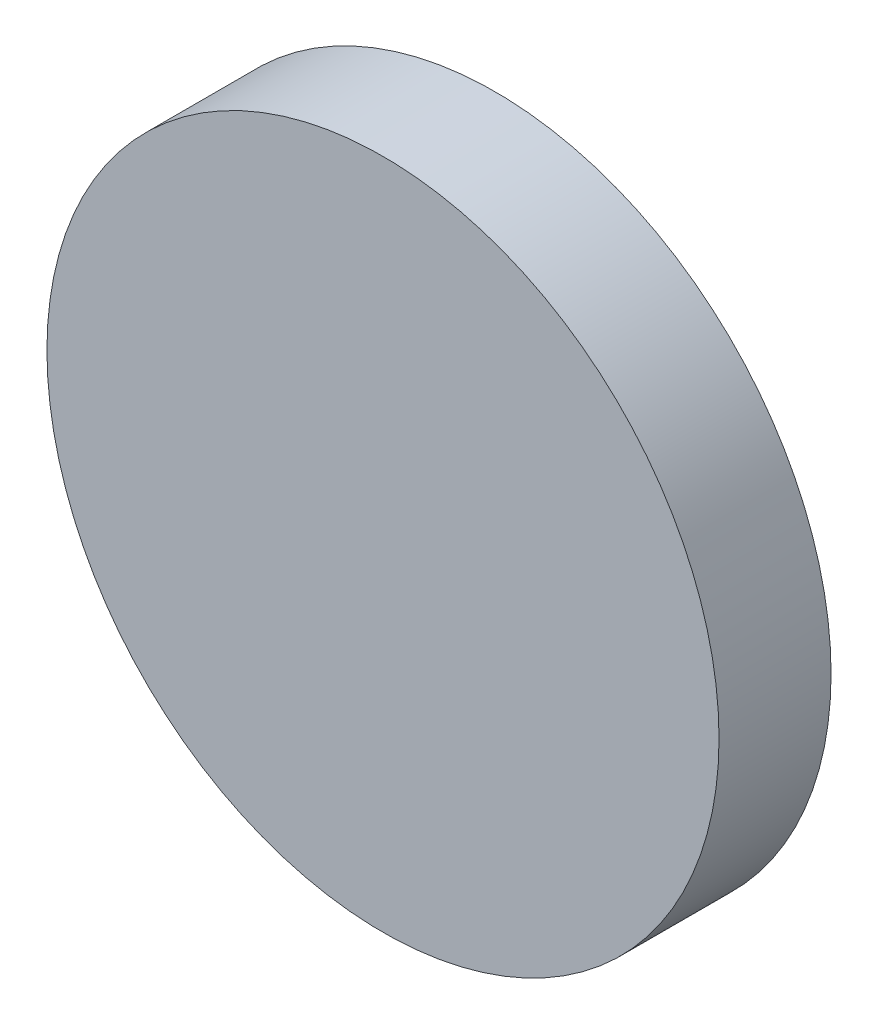
ISO-10303-21;
HEADER;
FILE_DESCRIPTION(('STEP AP214'),'2;1');
FILE_NAME('part.step','',(''),(''),'','','');
FILE_SCHEMA(('AUTOMOTIVE_DESIGN { 1 0 10303 214 1 1 1 1 }'));
ENDSEC;
DATA;
#1=APPLICATION_CONTEXT('core data for automotive mechanical design processes');
#2=APPLICATION_PROTOCOL_DEFINITION('international standard','automotive_design',2000,#1);
#3=PRODUCT_CONTEXT('',#1,'mechanical');
#4=PRODUCT('Part','Part','',(#3));
#5=PRODUCT_RELATED_PRODUCT_CATEGORY('part','',(#4));
#6=PRODUCT_DEFINITION_FORMATION('','',#4);
#7=PRODUCT_DEFINITION_CONTEXT('part definition',#1,'design');
#8=PRODUCT_DEFINITION('design','',#6,#7);
#9=PRODUCT_DEFINITION_SHAPE('','',#8);
#10=(LENGTH_UNIT() NAMED_UNIT(*) SI_UNIT(.MILLI.,.METRE.));
#11=(NAMED_UNIT(*) PLANE_ANGLE_UNIT() SI_UNIT($,.RADIAN.));
#12=(NAMED_UNIT(*) SI_UNIT($,.STERADIAN.) SOLID_ANGLE_UNIT());
#13=UNCERTAINTY_MEASURE_WITH_UNIT(LENGTH_MEASURE(1.E-05),#10,'distance_accuracy_value','');
#14=(GEOMETRIC_REPRESENTATION_CONTEXT(3) GLOBAL_UNCERTAINTY_ASSIGNED_CONTEXT((#13)) GLOBAL_UNIT_ASSIGNED_CONTEXT((#10,
#11,#12)) REPRESENTATION_CONTEXT('',''));
#15=CARTESIAN_POINT('',(0.,0.,0.));
#16=DIRECTION('',(0.,0.,1.));
#17=DIRECTION('',(1.,0.,0.));
#18=AXIS2_PLACEMENT_3D('',#15,#16,#17);
#19=CARTESIAN_POINT('',(0.,0.,2.));
#20=DIRECTION('',(0.,0.,-1.));
#21=DIRECTION('',(-1.,0.,0.));
#22=AXIS2_PLACEMENT_3D('',#19,#20,#21);
#23=CYLINDRICAL_SURFACE('',#22,6.);
#24=CARTESIAN_POINT('',(0.,0.,2.));
#25=DIRECTION('',(0.,0.,1.));
#26=DIRECTION('',(1.,0.,0.));
#27=AXIS2_PLACEMENT_3D('',#24,#25,#26);
#28=CIRCLE('',#27,6.);
#29=CARTESIAN_POINT('',(6.,0.,2.));
#30=VERTEX_POINT('',#29);
#31=EDGE_CURVE('E10',#30,#30,#28,.T.);
#32=ORIENTED_EDGE('',*,*,#31,.F.);
#33=EDGE_LOOP('',(#32));
#34=FACE_BOUND('',#33,.T.);
#35=CARTESIAN_POINT('',(0.,0.,0.));
#36=DIRECTION('',(0.,0.,1.));
#37=DIRECTION('',(1.,0.,0.));
#38=AXIS2_PLACEMENT_3D('',#35,#36,#37);
#39=CIRCLE('',#38,6.);
#40=CARTESIAN_POINT('',(6.,0.,0.));
#41=VERTEX_POINT('',#40);
#42=EDGE_CURVE('E40',#41,#41,#39,.T.);
#43=ORIENTED_EDGE('',*,*,#42,.T.);
#44=EDGE_LOOP('',(#43));
#45=FACE_BOUND('',#44,.T.);
#46=ADVANCED_FACE('F37',(#34,#45),#23,.T.);
#47=CARTESIAN_POINT('',(0.,0.,2.));
#48=DIRECTION('',(0.,0.,1.));
#49=DIRECTION('',(1.,0.,0.));
#50=AXIS2_PLACEMENT_3D('',#47,#48,#49);
#51=PLANE('',#50);
#52=ORIENTED_EDGE('',*,*,#31,.T.);
#53=EDGE_LOOP('',(#52));
#54=FACE_BOUND('',#53,.T.);
#55=ADVANCED_FACE('F52',(#54),#51,.T.);
#56=CARTESIAN_POINT('',(0.,0.,0.));
#57=DIRECTION('',(0.,0.,1.));
#58=DIRECTION('',(1.,0.,0.));
#59=AXIS2_PLACEMENT_3D('',#56,#57,#58);
#60=PLANE('',#59);
#61=ORIENTED_EDGE('',*,*,#42,.F.);
#62=EDGE_LOOP('',(#61));
#63=FACE_BOUND('',#62,.T.);
#64=ADVANCED_FACE('F50',(#63),#60,.F.);
#65=CLOSED_SHELL('',(#46,#55,#64));
#66=MANIFOLD_SOLID_BREP('B2',#65);
#67=ADVANCED_BREP_SHAPE_REPRESENTATION('',(#18,#66),#14);
#68=SHAPE_DEFINITION_REPRESENTATION(#9,#67);
ENDSEC;
END-ISO-10303-21;
